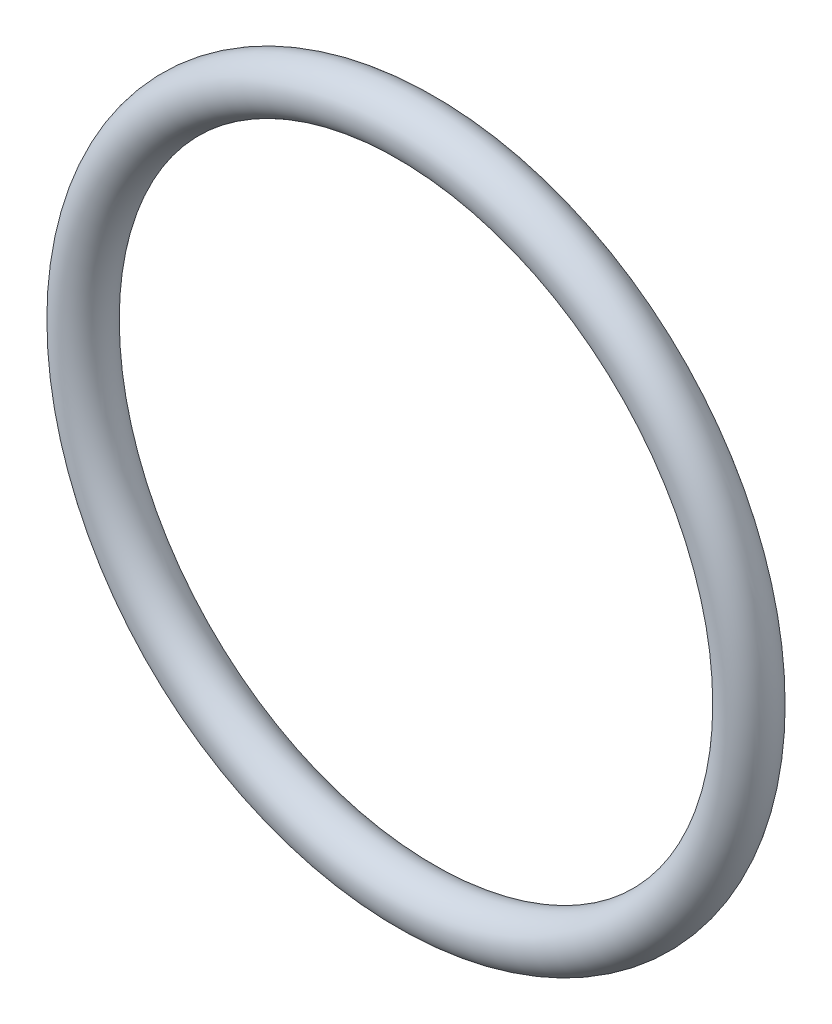
ISO-10303-21;
HEADER;
FILE_DESCRIPTION(('STEP AP214'),'2;1');
FILE_NAME('part.step','',(''),(''),'','','');
FILE_SCHEMA(('AUTOMOTIVE_DESIGN { 1 0 10303 214 1 1 1 1 }'));
ENDSEC;
DATA;
#1=APPLICATION_CONTEXT('core data for automotive mechanical design processes');
#2=APPLICATION_PROTOCOL_DEFINITION('international standard','automotive_design',2000,#1);
#3=PRODUCT_CONTEXT('',#1,'mechanical');
#4=PRODUCT('Part','Part','',(#3));
#5=PRODUCT_RELATED_PRODUCT_CATEGORY('part','',(#4));
#6=PRODUCT_DEFINITION_FORMATION('','',#4);
#7=PRODUCT_DEFINITION_CONTEXT('part definition',#1,'design');
#8=PRODUCT_DEFINITION('design','',#6,#7);
#9=PRODUCT_DEFINITION_SHAPE('','',#8);
#10=(LENGTH_UNIT() NAMED_UNIT(*) SI_UNIT(.MILLI.,.METRE.));
#11=(NAMED_UNIT(*) PLANE_ANGLE_UNIT() SI_UNIT($,.RADIAN.));
#12=(NAMED_UNIT(*) SI_UNIT($,.STERADIAN.) SOLID_ANGLE_UNIT());
#13=UNCERTAINTY_MEASURE_WITH_UNIT(LENGTH_MEASURE(1.E-05),#10,'distance_accuracy_value','');
#14=(GEOMETRIC_REPRESENTATION_CONTEXT(3) GLOBAL_UNCERTAINTY_ASSIGNED_CONTEXT((#13)) GLOBAL_UNIT_ASSIGNED_CONTEXT((#10,
#11,#12)) REPRESENTATION_CONTEXT('',''));
#15=CARTESIAN_POINT('',(0.,0.,0.));
#16=DIRECTION('',(0.,0.,1.));
#17=DIRECTION('',(1.,0.,0.));
#18=AXIS2_PLACEMENT_3D('',#15,#16,#17);
#19=CARTESIAN_POINT('',(0.,0.,0.));
#20=DIRECTION('',(0.,0.,-1.));
#21=DIRECTION('',(-1.,0.,0.));
#22=AXIS2_PLACEMENT_3D('',#19,#20,#21);
#23=TOROIDAL_SURFACE('',#22,10.31875,0.793749999999999);
#24=CARTESIAN_POINT('',(-11.1125,0.,0.));
#25=VERTEX_POINT('',#24);
#26=VERTEX_LOOP('',#25);
#27=FACE_BOUND('',#26,.T.);
#28=ADVANCED_FACE('F28',(#27),#23,.T.);
#29=CLOSED_SHELL('',(#28));
#30=MANIFOLD_SOLID_BREP('B2',#29);
#31=ADVANCED_BREP_SHAPE_REPRESENTATION('',(#18,#30),#14);
#32=SHAPE_DEFINITION_REPRESENTATION(#9,#31);
ENDSEC;
END-ISO-10303-21;
